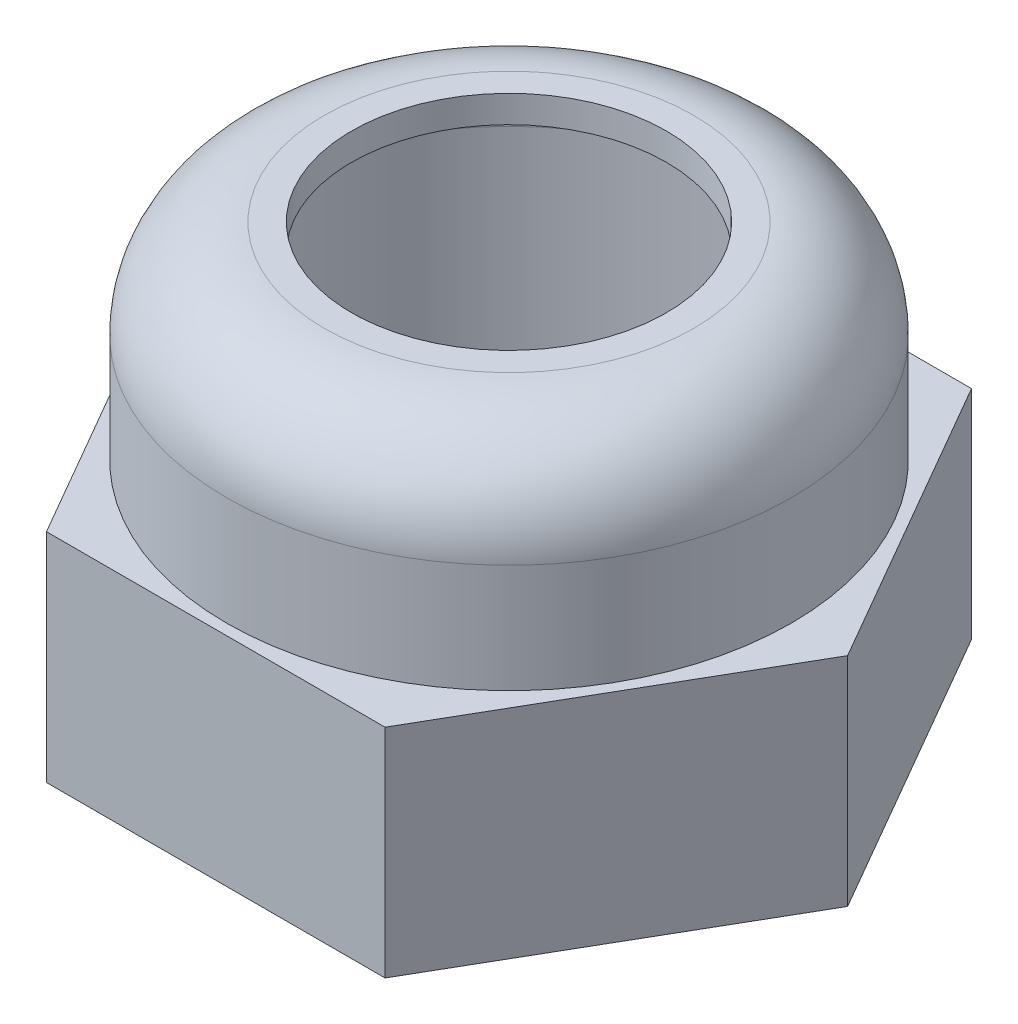
ISO-10303-21;
HEADER;
FILE_DESCRIPTION(('STEP AP214'),'2;1');
FILE_NAME('part.step','',(''),(''),'','','');
FILE_SCHEMA(('AUTOMOTIVE_DESIGN { 1 0 10303 214 1 1 1 1 }'));
ENDSEC;
DATA;
#1=APPLICATION_CONTEXT('core data for automotive mechanical design processes');
#2=APPLICATION_PROTOCOL_DEFINITION('international standard','automotive_design',2000,#1);
#3=PRODUCT_CONTEXT('',#1,'mechanical');
#4=PRODUCT('Part','Part','',(#3));
#5=PRODUCT_RELATED_PRODUCT_CATEGORY('part','',(#4));
#6=PRODUCT_DEFINITION_FORMATION('','',#4);
#7=PRODUCT_DEFINITION_CONTEXT('part definition',#1,'design');
#8=PRODUCT_DEFINITION('design','',#6,#7);
#9=PRODUCT_DEFINITION_SHAPE('','',#8);
#10=(LENGTH_UNIT() NAMED_UNIT(*) SI_UNIT(.MILLI.,.METRE.));
#11=(NAMED_UNIT(*) PLANE_ANGLE_UNIT() SI_UNIT($,.RADIAN.));
#12=(NAMED_UNIT(*) SI_UNIT($,.STERADIAN.) SOLID_ANGLE_UNIT());
#13=UNCERTAINTY_MEASURE_WITH_UNIT(LENGTH_MEASURE(1.E-05),#10,'distance_accuracy_value','');
#14=(GEOMETRIC_REPRESENTATION_CONTEXT(3) GLOBAL_UNCERTAINTY_ASSIGNED_CONTEXT((#13)) GLOBAL_UNIT_ASSIGNED_CONTEXT((#10,
#11,#12)) REPRESENTATION_CONTEXT('',''));
#15=CARTESIAN_POINT('',(0.,0.,0.));
#16=DIRECTION('',(0.,0.,1.));
#17=DIRECTION('',(1.,0.,0.));
#18=AXIS2_PLACEMENT_3D('',#15,#16,#17);
#19=CARTESIAN_POINT('',(0.,10.,0.));
#20=DIRECTION('',(0.,1.,0.));
#21=DIRECTION('',(0.,0.,1.));
#22=AXIS2_PLACEMENT_3D('',#19,#20,#21);
#23=PLANE('',#22);
#24=DIRECTION('',(0.5,0.,-0.866025403784439));
#25=VECTOR('',#24,1.);
#26=CARTESIAN_POINT('',(7.79422863405994,10.,13.5));
#27=LINE('',#26,#25);
#28=CARTESIAN_POINT('',(7.79422863405994,10.,13.5));
#29=VERTEX_POINT('',#28);
#30=CARTESIAN_POINT('',(15.5884572681199,10.,0.));
#31=VERTEX_POINT('',#30);
#32=EDGE_CURVE('E128',#29,#31,#27,.T.);
#33=ORIENTED_EDGE('',*,*,#32,.T.);
#34=DIRECTION('',(-0.5,0.,-0.866025403784438));
#35=VECTOR('',#34,1.);
#36=CARTESIAN_POINT('',(15.5884572681199,10.,0.));
#37=LINE('',#36,#35);
#38=CARTESIAN_POINT('',(7.79422863405993,10.,-13.5));
#39=VERTEX_POINT('',#38);
#40=EDGE_CURVE('E86',#31,#39,#37,.T.);
#41=ORIENTED_EDGE('',*,*,#40,.T.);
#42=DIRECTION('',(-1.,0.,0.));
#43=VECTOR('',#42,1.);
#44=CARTESIAN_POINT('',(7.79422863405993,10.,-13.5));
#45=LINE('',#44,#43);
#46=CARTESIAN_POINT('',(-7.79422863405996,10.,-13.5));
#47=VERTEX_POINT('',#46);
#48=EDGE_CURVE('E99',#39,#47,#45,.T.);
#49=ORIENTED_EDGE('',*,*,#48,.T.);
#50=DIRECTION('',(-0.5,0.,0.866025403784439));
#51=VECTOR('',#50,1.);
#52=CARTESIAN_POINT('',(-7.79422863405996,10.,-13.5));
#53=LINE('',#52,#51);
#54=CARTESIAN_POINT('',(-15.5884572681199,10.,0.));
#55=VERTEX_POINT('',#54);
#56=EDGE_CURVE('E93',#47,#55,#53,.T.);
#57=ORIENTED_EDGE('',*,*,#56,.T.);
#58=DIRECTION('',(0.5,0.,0.866025403784439));
#59=VECTOR('',#58,1.);
#60=CARTESIAN_POINT('',(-15.5884572681199,10.,0.));
#61=LINE('',#60,#59);
#62=CARTESIAN_POINT('',(-7.79422863405997,10.,13.5));
#63=VERTEX_POINT('',#62);
#64=EDGE_CURVE('E97',#55,#63,#61,.T.);
#65=ORIENTED_EDGE('',*,*,#64,.T.);
#66=DIRECTION('',(1.,0.,0.));
#67=VECTOR('',#66,1.);
#68=CARTESIAN_POINT('',(-7.79422863405997,10.,13.5));
#69=LINE('',#68,#67);
#70=EDGE_CURVE('E49',#63,#29,#69,.T.);
#71=ORIENTED_EDGE('',*,*,#70,.T.);
#72=EDGE_LOOP('',(#33,#41,#49,#57,#65,#71));
#73=FACE_BOUND('',#72,.T.);
#74=CARTESIAN_POINT('',(0.,10.,0.));
#75=DIRECTION('',(0.,1.,0.));
#76=DIRECTION('',(0.,0.,1.));
#77=AXIS2_PLACEMENT_3D('',#74,#75,#76);
#78=CIRCLE('',#77,13.);
#79=CARTESIAN_POINT('',(0.,10.,13.));
#80=VERTEX_POINT('',#79);
#81=EDGE_CURVE('E192',#80,#80,#78,.T.);
#82=ORIENTED_EDGE('',*,*,#81,.F.);
#83=EDGE_LOOP('',(#82));
#84=FACE_BOUND('',#83,.T.);
#85=ADVANCED_FACE('F32',(#73,#84),#23,.T.);
#86=CARTESIAN_POINT('',(0.,0.,0.));
#87=DIRECTION('',(0.,1.,0.));
#88=DIRECTION('',(0.,0.,1.));
#89=AXIS2_PLACEMENT_3D('',#86,#87,#88);
#90=PLANE('',#89);
#91=DIRECTION('',(0.5,0.,-0.866025403784439));
#92=VECTOR('',#91,1.);
#93=CARTESIAN_POINT('',(7.79422863405994,0.,13.5));
#94=LINE('',#93,#92);
#95=CARTESIAN_POINT('',(7.79422863405994,0.,13.5));
#96=VERTEX_POINT('',#95);
#97=CARTESIAN_POINT('',(15.5884572681199,0.,0.));
#98=VERTEX_POINT('',#97);
#99=EDGE_CURVE('E117',#96,#98,#94,.T.);
#100=ORIENTED_EDGE('',*,*,#99,.F.);
#101=DIRECTION('',(1.,0.,0.));
#102=VECTOR('',#101,1.);
#103=CARTESIAN_POINT('',(-7.79422863405997,0.,13.5));
#104=LINE('',#103,#102);
#105=CARTESIAN_POINT('',(-7.79422863405997,0.,13.5));
#106=VERTEX_POINT('',#105);
#107=EDGE_CURVE('E78',#106,#96,#104,.T.);
#108=ORIENTED_EDGE('',*,*,#107,.F.);
#109=DIRECTION('',(0.5,0.,0.866025403784439));
#110=VECTOR('',#109,1.);
#111=CARTESIAN_POINT('',(-15.5884572681199,0.,0.));
#112=LINE('',#111,#110);
#113=CARTESIAN_POINT('',(-15.5884572681199,0.,0.));
#114=VERTEX_POINT('',#113);
#115=EDGE_CURVE('E72',#114,#106,#112,.T.);
#116=ORIENTED_EDGE('',*,*,#115,.F.);
#117=DIRECTION('',(-0.5,0.,0.866025403784439));
#118=VECTOR('',#117,1.);
#119=CARTESIAN_POINT('',(-7.79422863405996,0.,-13.5));
#120=LINE('',#119,#118);
#121=CARTESIAN_POINT('',(-7.79422863405996,0.,-13.5));
#122=VERTEX_POINT('',#121);
#123=EDGE_CURVE('E107',#122,#114,#120,.T.);
#124=ORIENTED_EDGE('',*,*,#123,.F.);
#125=DIRECTION('',(-1.,0.,0.));
#126=VECTOR('',#125,1.);
#127=CARTESIAN_POINT('',(7.79422863405993,0.,-13.5));
#128=LINE('',#127,#126);
#129=CARTESIAN_POINT('',(7.79422863405993,0.,-13.5));
#130=VERTEX_POINT('',#129);
#131=EDGE_CURVE('E123',#130,#122,#128,.T.);
#132=ORIENTED_EDGE('',*,*,#131,.F.);
#133=DIRECTION('',(-0.5,0.,-0.866025403784438));
#134=VECTOR('',#133,1.);
#135=CARTESIAN_POINT('',(15.5884572681199,0.,0.));
#136=LINE('',#135,#134);
#137=EDGE_CURVE('E120',#98,#130,#136,.T.);
#138=ORIENTED_EDGE('',*,*,#137,.F.);
#139=EDGE_LOOP('',(#100,#108,#116,#124,#132,#138));
#140=FACE_BOUND('',#139,.T.);
#141=CARTESIAN_POINT('',(0.,0.,0.));
#142=DIRECTION('',(0.,1.,0.));
#143=DIRECTION('',(0.,0.,1.));
#144=AXIS2_PLACEMENT_3D('',#141,#142,#143);
#145=CIRCLE('',#144,11.75);
#146=CARTESIAN_POINT('',(0.,0.,11.75));
#147=VERTEX_POINT('',#146);
#148=EDGE_CURVE('E121',#147,#147,#145,.T.);
#149=ORIENTED_EDGE('',*,*,#148,.T.);
#150=EDGE_LOOP('',(#149));
#151=FACE_BOUND('',#150,.T.);
#152=ADVANCED_FACE('F137',(#140,#151),#90,.F.);
#153=CARTESIAN_POINT('',(7.79422863405994,10.,13.5));
#154=DIRECTION('',(-0.866025403784439,0.,-0.5));
#155=DIRECTION('',(-0.5,0.,0.866025403784439));
#156=AXIS2_PLACEMENT_3D('',#153,#154,#155);
#157=PLANE('',#156);
#158=ORIENTED_EDGE('',*,*,#99,.T.);
#159=DIRECTION('',(0.,-1.,0.));
#160=VECTOR('',#159,1.);
#161=CARTESIAN_POINT('',(15.5884572681199,10.,0.));
#162=LINE('',#161,#160);
#163=EDGE_CURVE('E11',#31,#98,#162,.T.);
#164=ORIENTED_EDGE('',*,*,#163,.F.);
#165=ORIENTED_EDGE('',*,*,#32,.F.);
#166=DIRECTION('',(0.,-1.,0.));
#167=VECTOR('',#166,1.);
#168=CARTESIAN_POINT('',(7.79422863405994,10.,13.5));
#169=LINE('',#168,#167);
#170=EDGE_CURVE('E113',#29,#96,#169,.T.);
#171=ORIENTED_EDGE('',*,*,#170,.T.);
#172=EDGE_LOOP('',(#158,#164,#165,#171));
#173=FACE_BOUND('',#172,.T.);
#174=ADVANCED_FACE('F34',(#173),#157,.F.);
#175=CARTESIAN_POINT('',(15.5884572681199,10.,0.));
#176=DIRECTION('',(-0.866025403784438,0.,0.5));
#177=DIRECTION('',(0.5,0.,0.866025403784438));
#178=AXIS2_PLACEMENT_3D('',#175,#176,#177);
#179=PLANE('',#178);
#180=ORIENTED_EDGE('',*,*,#137,.T.);
#181=DIRECTION('',(0.,-1.,0.));
#182=VECTOR('',#181,1.);
#183=CARTESIAN_POINT('',(7.79422863405993,10.,-13.5));
#184=LINE('',#183,#182);
#185=EDGE_CURVE('E41',#39,#130,#184,.T.);
#186=ORIENTED_EDGE('',*,*,#185,.F.);
#187=ORIENTED_EDGE('',*,*,#40,.F.);
#188=ORIENTED_EDGE('',*,*,#163,.T.);
#189=EDGE_LOOP('',(#180,#186,#187,#188));
#190=FACE_BOUND('',#189,.T.);
#191=ADVANCED_FACE('F281',(#190),#179,.F.);
#192=CARTESIAN_POINT('',(7.79422863405993,10.,-13.5));
#193=DIRECTION('',(0.,0.,1.));
#194=DIRECTION('',(1.,0.,0.));
#195=AXIS2_PLACEMENT_3D('',#192,#193,#194);
#196=PLANE('',#195);
#197=ORIENTED_EDGE('',*,*,#131,.T.);
#198=DIRECTION('',(0.,-1.,0.));
#199=VECTOR('',#198,1.);
#200=CARTESIAN_POINT('',(-7.79422863405996,10.,-13.5));
#201=LINE('',#200,#199);
#202=EDGE_CURVE('E108',#47,#122,#201,.T.);
#203=ORIENTED_EDGE('',*,*,#202,.F.);
#204=ORIENTED_EDGE('',*,*,#48,.F.);
#205=ORIENTED_EDGE('',*,*,#185,.T.);
#206=EDGE_LOOP('',(#197,#203,#204,#205));
#207=FACE_BOUND('',#206,.T.);
#208=ADVANCED_FACE('F134',(#207),#196,.F.);
#209=CARTESIAN_POINT('',(-7.79422863405996,10.,-13.5));
#210=DIRECTION('',(0.866025403784439,0.,0.5));
#211=DIRECTION('',(0.5,0.,-0.866025403784439));
#212=AXIS2_PLACEMENT_3D('',#209,#210,#211);
#213=PLANE('',#212);
#214=ORIENTED_EDGE('',*,*,#123,.T.);
#215=DIRECTION('',(0.,-1.,0.));
#216=VECTOR('',#215,1.);
#217=CARTESIAN_POINT('',(-15.5884572681199,10.,0.));
#218=LINE('',#217,#216);
#219=EDGE_CURVE('E104',#55,#114,#218,.T.);
#220=ORIENTED_EDGE('',*,*,#219,.F.);
#221=ORIENTED_EDGE('',*,*,#56,.F.);
#222=ORIENTED_EDGE('',*,*,#202,.T.);
#223=EDGE_LOOP('',(#214,#220,#221,#222));
#224=FACE_BOUND('',#223,.T.);
#225=ADVANCED_FACE('F105',(#224),#213,.F.);
#226=CARTESIAN_POINT('',(-15.5884572681199,10.,0.));
#227=DIRECTION('',(0.866025403784439,0.,-0.5));
#228=DIRECTION('',(-0.5,0.,-0.866025403784439));
#229=AXIS2_PLACEMENT_3D('',#226,#227,#228);
#230=PLANE('',#229);
#231=ORIENTED_EDGE('',*,*,#115,.T.);
#232=DIRECTION('',(0.,-1.,0.));
#233=VECTOR('',#232,1.);
#234=CARTESIAN_POINT('',(-7.79422863405997,10.,13.5));
#235=LINE('',#234,#233);
#236=EDGE_CURVE('E109',#63,#106,#235,.T.);
#237=ORIENTED_EDGE('',*,*,#236,.F.);
#238=ORIENTED_EDGE('',*,*,#64,.F.);
#239=ORIENTED_EDGE('',*,*,#219,.T.);
#240=EDGE_LOOP('',(#231,#237,#238,#239));
#241=FACE_BOUND('',#240,.T.);
#242=ADVANCED_FACE('F111',(#241),#230,.F.);
#243=CARTESIAN_POINT('',(-7.79422863405997,10.,13.5));
#244=DIRECTION('',(0.,0.,-1.));
#245=DIRECTION('',(-1.,0.,0.));
#246=AXIS2_PLACEMENT_3D('',#243,#244,#245);
#247=PLANE('',#246);
#248=ORIENTED_EDGE('',*,*,#107,.T.);
#249=ORIENTED_EDGE('',*,*,#170,.F.);
#250=ORIENTED_EDGE('',*,*,#70,.F.);
#251=ORIENTED_EDGE('',*,*,#236,.T.);
#252=EDGE_LOOP('',(#248,#249,#250,#251));
#253=FACE_BOUND('',#252,.T.);
#254=ADVANCED_FACE('F142',(#253),#247,.F.);
#255=CARTESIAN_POINT('',(0.,10.,0.));
#256=DIRECTION('',(0.,-1.,0.));
#257=DIRECTION('',(0.,0.,-1.));
#258=AXIS2_PLACEMENT_3D('',#255,#256,#257);
#259=CYLINDRICAL_SURFACE('',#258,11.75);
#260=ORIENTED_EDGE('',*,*,#148,.F.);
#261=EDGE_LOOP('',(#260));
#262=FACE_BOUND('',#261,.T.);
#263=CARTESIAN_POINT('',(0.,15.,0.));
#264=DIRECTION('',(0.,-1.,0.));
#265=DIRECTION('',(0.,0.,-1.));
#266=AXIS2_PLACEMENT_3D('',#263,#264,#265);
#267=CIRCLE('',#266,11.75);
#268=CARTESIAN_POINT('',(0.,15.,-11.75));
#269=VERTEX_POINT('',#268);
#270=EDGE_CURVE('E197',#269,#269,#267,.T.);
#271=ORIENTED_EDGE('',*,*,#270,.F.);
#272=EDGE_LOOP('',(#271));
#273=FACE_BOUND('',#272,.T.);
#274=ADVANCED_FACE('F144',(#262,#273),#259,.F.);
#275=CARTESIAN_POINT('',(0.,15.,0.));
#276=DIRECTION('',(0.,-1.,0.));
#277=DIRECTION('',(0.,0.,-1.));
#278=AXIS2_PLACEMENT_3D('',#275,#276,#277);
#279=CYLINDRICAL_SURFACE('',#278,13.);
#280=CARTESIAN_POINT('',(0.,15.,0.));
#281=DIRECTION('',(0.,1.,0.));
#282=DIRECTION('',(0.,0.,1.));
#283=AXIS2_PLACEMENT_3D('',#280,#281,#282);
#284=CIRCLE('',#283,13.);
#285=CARTESIAN_POINT('',(0.,15.,13.));
#286=VERTEX_POINT('',#285);
#287=EDGE_CURVE('E191',#286,#286,#284,.T.);
#288=ORIENTED_EDGE('',*,*,#287,.F.);
#289=EDGE_LOOP('',(#288));
#290=FACE_BOUND('',#289,.T.);
#291=ORIENTED_EDGE('',*,*,#81,.T.);
#292=EDGE_LOOP('',(#291));
#293=FACE_BOUND('',#292,.T.);
#294=ADVANCED_FACE('F150',(#290,#293),#279,.T.);
#295=CARTESIAN_POINT('',(0.,15.,0.));
#296=DIRECTION('',(0.,-1.,0.));
#297=DIRECTION('',(0.,0.,-1.));
#298=AXIS2_PLACEMENT_3D('',#295,#296,#297);
#299=TOROIDAL_SURFACE('',#298,8.5,3.25);
#300=CARTESIAN_POINT('',(0.,18.25,0.));
#301=DIRECTION('',(0.,-1.,0.));
#302=DIRECTION('',(0.,0.,-1.));
#303=AXIS2_PLACEMENT_3D('',#300,#301,#302);
#304=CIRCLE('',#303,8.5);
#305=CARTESIAN_POINT('',(0.,18.25,-8.5));
#306=VERTEX_POINT('',#305);
#307=EDGE_CURVE('E204',#306,#306,#304,.T.);
#308=ORIENTED_EDGE('',*,*,#307,.F.);
#309=EDGE_LOOP('',(#308));
#310=FACE_BOUND('',#309,.T.);
#311=ORIENTED_EDGE('',*,*,#270,.T.);
#312=EDGE_LOOP('',(#311));
#313=FACE_BOUND('',#312,.T.);
#314=ADVANCED_FACE('F163',(#310,#313),#299,.F.);
#315=CARTESIAN_POINT('',(0.,18.25,0.));
#316=DIRECTION('',(0.,-1.,0.));
#317=DIRECTION('',(0.,0.,-1.));
#318=AXIS2_PLACEMENT_3D('',#315,#316,#317);
#319=PLANE('',#318);
#320=ORIENTED_EDGE('',*,*,#307,.T.);
#321=EDGE_LOOP('',(#320));
#322=FACE_BOUND('',#321,.T.);
#323=CARTESIAN_POINT('',(0.,18.25,0.));
#324=DIRECTION('',(0.,-1.,0.));
#325=DIRECTION('',(0.,0.,-1.));
#326=AXIS2_PLACEMENT_3D('',#323,#324,#325);
#327=CIRCLE('',#326,7.25);
#328=CARTESIAN_POINT('',(0.,18.25,-7.25));
#329=VERTEX_POINT('',#328);
#330=EDGE_CURVE('E207',#329,#329,#327,.T.);
#331=ORIENTED_EDGE('',*,*,#330,.F.);
#332=EDGE_LOOP('',(#331));
#333=FACE_BOUND('',#332,.T.);
#334=ADVANCED_FACE('F167',(#322,#333),#319,.T.);
#335=CARTESIAN_POINT('',(0.,0.,0.));
#336=DIRECTION('',(0.,-1.,0.));
#337=DIRECTION('',(0.,0.,-1.));
#338=AXIS2_PLACEMENT_3D('',#335,#336,#337);
#339=CYLINDRICAL_SURFACE('',#338,7.25);
#340=ORIENTED_EDGE('',*,*,#330,.T.);
#341=EDGE_LOOP('',(#340));
#342=FACE_BOUND('',#341,.T.);
#343=CARTESIAN_POINT('',(0.,19.5,0.));
#344=DIRECTION('',(0.,-1.,0.));
#345=DIRECTION('',(0.,0.,-1.));
#346=AXIS2_PLACEMENT_3D('',#343,#344,#345);
#347=CIRCLE('',#346,7.25);
#348=CARTESIAN_POINT('',(0.,19.5,-7.25));
#349=VERTEX_POINT('',#348);
#350=EDGE_CURVE('E210',#349,#349,#347,.T.);
#351=ORIENTED_EDGE('',*,*,#350,.F.);
#352=EDGE_LOOP('',(#351));
#353=FACE_BOUND('',#352,.T.);
#354=ADVANCED_FACE('F171',(#342,#353),#339,.F.);
#355=CARTESIAN_POINT('',(0.,19.5,0.));
#356=DIRECTION('',(0.,1.,0.));
#357=DIRECTION('',(0.,0.,1.));
#358=AXIS2_PLACEMENT_3D('',#355,#356,#357);
#359=PLANE('',#358);
#360=ORIENTED_EDGE('',*,*,#350,.T.);
#361=EDGE_LOOP('',(#360));
#362=FACE_BOUND('',#361,.T.);
#363=CARTESIAN_POINT('',(0.,19.5,0.));
#364=DIRECTION('',(0.,-1.,0.));
#365=DIRECTION('',(0.,0.,-1.));
#366=AXIS2_PLACEMENT_3D('',#363,#364,#365);
#367=CIRCLE('',#366,8.5);
#368=CARTESIAN_POINT('',(0.,19.5,-8.5));
#369=VERTEX_POINT('',#368);
#370=EDGE_CURVE('E188',#369,#369,#367,.T.);
#371=ORIENTED_EDGE('',*,*,#370,.F.);
#372=EDGE_LOOP('',(#371));
#373=FACE_BOUND('',#372,.T.);
#374=ADVANCED_FACE('F175',(#362,#373),#359,.T.);
#375=CARTESIAN_POINT('',(0.,15.,0.));
#376=DIRECTION('',(0.,-1.,0.));
#377=DIRECTION('',(0.,0.,-1.));
#378=AXIS2_PLACEMENT_3D('',#375,#376,#377);
#379=TOROIDAL_SURFACE('',#378,8.5,4.5);
#380=ORIENTED_EDGE('',*,*,#370,.T.);
#381=EDGE_LOOP('',(#380));
#382=FACE_BOUND('',#381,.T.);
#383=ORIENTED_EDGE('',*,*,#287,.T.);
#384=EDGE_LOOP('',(#383));
#385=FACE_BOUND('',#384,.T.);
#386=ADVANCED_FACE('F179',(#382,#385),#379,.T.);
#387=CLOSED_SHELL('',(#85,#152,#174,#191,#208,#225,#242,#254,#274,#294,#314,#334,#354,#374,#386));
#388=MANIFOLD_SOLID_BREP('B2',#387);
#389=ADVANCED_BREP_SHAPE_REPRESENTATION('',(#18,#388),#14);
#390=SHAPE_DEFINITION_REPRESENTATION(#9,#389);
ENDSEC;
END-ISO-10303-21;
